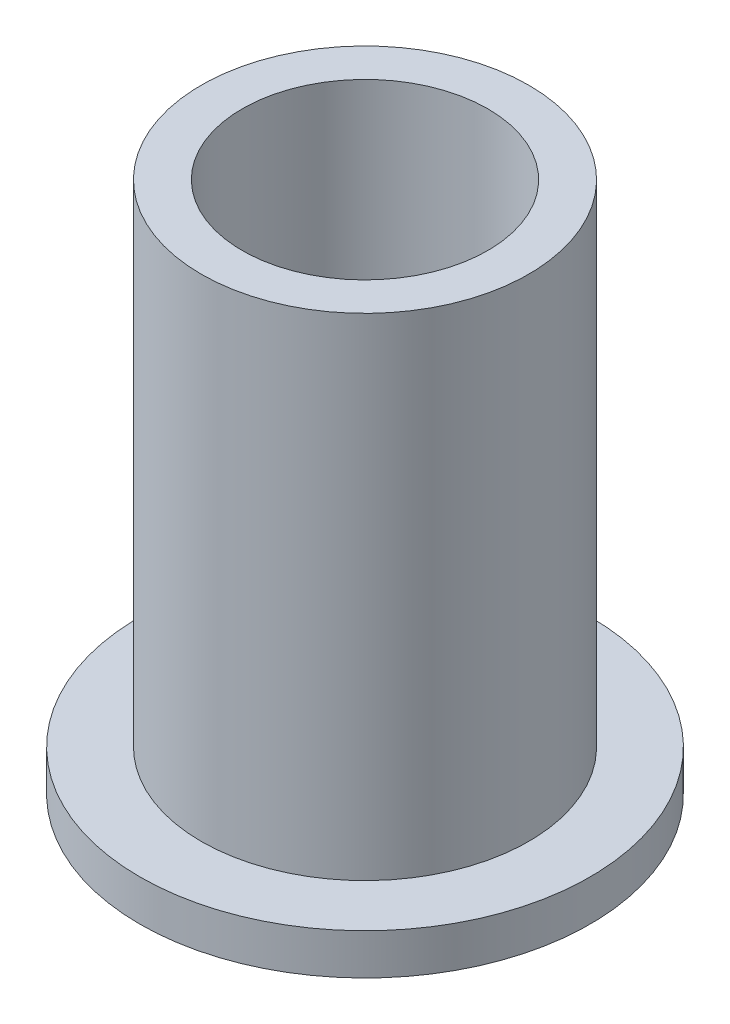
ISO-10303-21;
HEADER;
FILE_DESCRIPTION(('STEP AP214'),'2;1');
FILE_NAME('part.step','',(''),(''),'','','');
FILE_SCHEMA(('AUTOMOTIVE_DESIGN { 1 0 10303 214 1 1 1 1 }'));
ENDSEC;
DATA;
#1=APPLICATION_CONTEXT('core data for automotive mechanical design processes');
#2=APPLICATION_PROTOCOL_DEFINITION('international standard','automotive_design',2000,#1);
#3=PRODUCT_CONTEXT('',#1,'mechanical');
#4=PRODUCT('Part','Part','',(#3));
#5=PRODUCT_RELATED_PRODUCT_CATEGORY('part','',(#4));
#6=PRODUCT_DEFINITION_FORMATION('','',#4);
#7=PRODUCT_DEFINITION_CONTEXT('part definition',#1,'design');
#8=PRODUCT_DEFINITION('design','',#6,#7);
#9=PRODUCT_DEFINITION_SHAPE('','',#8);
#10=(LENGTH_UNIT() NAMED_UNIT(*) SI_UNIT(.MILLI.,.METRE.));
#11=(NAMED_UNIT(*) PLANE_ANGLE_UNIT() SI_UNIT($,.RADIAN.));
#12=(NAMED_UNIT(*) SI_UNIT($,.STERADIAN.) SOLID_ANGLE_UNIT());
#13=UNCERTAINTY_MEASURE_WITH_UNIT(LENGTH_MEASURE(1.E-05),#10,'distance_accuracy_value','');
#14=(GEOMETRIC_REPRESENTATION_CONTEXT(3) GLOBAL_UNCERTAINTY_ASSIGNED_CONTEXT((#13)) GLOBAL_UNIT_ASSIGNED_CONTEXT((#10,
#11,#12)) REPRESENTATION_CONTEXT('',''));
#15=CARTESIAN_POINT('',(0.,0.,0.));
#16=DIRECTION('',(0.,0.,1.));
#17=DIRECTION('',(1.,0.,0.));
#18=AXIS2_PLACEMENT_3D('',#15,#16,#17);
#19=CARTESIAN_POINT('',(8.73125,0.,0.));
#20=DIRECTION('',(0.,-1.,0.));
#21=DIRECTION('',(0.,0.,-1.));
#22=AXIS2_PLACEMENT_3D('',#19,#20,#21);
#23=PLANE('',#22);
#24=CARTESIAN_POINT('',(0.,0.,0.));
#25=DIRECTION('',(0.,-1.,0.));
#26=DIRECTION('',(0.,0.,-1.));
#27=AXIS2_PLACEMENT_3D('',#24,#25,#26);
#28=CIRCLE('',#27,8.73125);
#29=CARTESIAN_POINT('',(0.,0.,-8.73125));
#30=VERTEX_POINT('',#29);
#31=EDGE_CURVE('E52',#30,#30,#28,.T.);
#32=ORIENTED_EDGE('',*,*,#31,.T.);
#33=EDGE_LOOP('',(#32));
#34=FACE_BOUND('',#33,.T.);
#35=CARTESIAN_POINT('',(0.,0.,0.));
#36=DIRECTION('',(0.,-1.,0.));
#37=DIRECTION('',(0.,0.,-1.));
#38=AXIS2_PLACEMENT_3D('',#35,#36,#37);
#39=CIRCLE('',#38,4.7625);
#40=CARTESIAN_POINT('',(0.,0.,-4.7625));
#41=VERTEX_POINT('',#40);
#42=EDGE_CURVE('E10',#41,#41,#39,.T.);
#43=ORIENTED_EDGE('',*,*,#42,.F.);
#44=EDGE_LOOP('',(#43));
#45=FACE_BOUND('',#44,.T.);
#46=ADVANCED_FACE('F30',(#34,#45),#23,.T.);
#47=CARTESIAN_POINT('',(0.,0.,0.));
#48=DIRECTION('',(0.,-1.,0.));
#49=DIRECTION('',(0.,0.,-1.));
#50=AXIS2_PLACEMENT_3D('',#47,#48,#49);
#51=CYLINDRICAL_SURFACE('',#50,4.7625);
#52=ORIENTED_EDGE('',*,*,#42,.T.);
#53=EDGE_LOOP('',(#52));
#54=FACE_BOUND('',#53,.T.);
#55=CARTESIAN_POINT('',(0.,20.6375,0.));
#56=DIRECTION('',(0.,-1.,0.));
#57=DIRECTION('',(0.,0.,-1.));
#58=AXIS2_PLACEMENT_3D('',#55,#56,#57);
#59=CIRCLE('',#58,4.7625);
#60=CARTESIAN_POINT('',(0.,20.6375,-4.7625));
#61=VERTEX_POINT('',#60);
#62=EDGE_CURVE('E36',#61,#61,#59,.T.);
#63=ORIENTED_EDGE('',*,*,#62,.F.);
#64=EDGE_LOOP('',(#63));
#65=FACE_BOUND('',#64,.T.);
#66=ADVANCED_FACE('F70',(#54,#65),#51,.F.);
#67=CARTESIAN_POINT('',(4.7625,20.6375,0.));
#68=DIRECTION('',(0.,1.,0.));
#69=DIRECTION('',(0.,0.,1.));
#70=AXIS2_PLACEMENT_3D('',#67,#68,#69);
#71=PLANE('',#70);
#72=ORIENTED_EDGE('',*,*,#62,.T.);
#73=EDGE_LOOP('',(#72));
#74=FACE_BOUND('',#73,.T.);
#75=CARTESIAN_POINT('',(0.,20.6375,0.));
#76=DIRECTION('',(0.,-1.,0.));
#77=DIRECTION('',(0.,0.,-1.));
#78=AXIS2_PLACEMENT_3D('',#75,#76,#77);
#79=CIRCLE('',#78,6.35);
#80=CARTESIAN_POINT('',(0.,20.6375,-6.35));
#81=VERTEX_POINT('',#80);
#82=EDGE_CURVE('E40',#81,#81,#79,.T.);
#83=ORIENTED_EDGE('',*,*,#82,.F.);
#84=EDGE_LOOP('',(#83));
#85=FACE_BOUND('',#84,.T.);
#86=ADVANCED_FACE('F74',(#74,#85),#71,.T.);
#87=CARTESIAN_POINT('',(0.,0.,0.));
#88=DIRECTION('',(0.,-1.,0.));
#89=DIRECTION('',(0.,0.,-1.));
#90=AXIS2_PLACEMENT_3D('',#87,#88,#89);
#91=CYLINDRICAL_SURFACE('',#90,6.35);
#92=ORIENTED_EDGE('',*,*,#82,.T.);
#93=EDGE_LOOP('',(#92));
#94=FACE_BOUND('',#93,.T.);
#95=CARTESIAN_POINT('',(0.,1.5875,0.));
#96=DIRECTION('',(0.,-1.,0.));
#97=DIRECTION('',(0.,0.,-1.));
#98=AXIS2_PLACEMENT_3D('',#95,#96,#97);
#99=CIRCLE('',#98,6.35000000000001);
#100=CARTESIAN_POINT('',(0.,1.5875,-6.35000000000001));
#101=VERTEX_POINT('',#100);
#102=EDGE_CURVE('E44',#101,#101,#99,.T.);
#103=ORIENTED_EDGE('',*,*,#102,.F.);
#104=EDGE_LOOP('',(#103));
#105=FACE_BOUND('',#104,.T.);
#106=ADVANCED_FACE('F66',(#94,#105),#91,.T.);
#107=CARTESIAN_POINT('',(6.35000000000001,1.5875,0.));
#108=DIRECTION('',(0.,1.,0.));
#109=DIRECTION('',(0.,0.,1.));
#110=AXIS2_PLACEMENT_3D('',#107,#108,#109);
#111=PLANE('',#110);
#112=ORIENTED_EDGE('',*,*,#102,.T.);
#113=EDGE_LOOP('',(#112));
#114=FACE_BOUND('',#113,.T.);
#115=CARTESIAN_POINT('',(0.,1.5875,0.));
#116=DIRECTION('',(0.,-1.,0.));
#117=DIRECTION('',(0.,0.,-1.));
#118=AXIS2_PLACEMENT_3D('',#115,#116,#117);
#119=CIRCLE('',#118,8.73125);
#120=CARTESIAN_POINT('',(0.,1.5875,-8.73125));
#121=VERTEX_POINT('',#120);
#122=EDGE_CURVE('E49',#121,#121,#119,.T.);
#123=ORIENTED_EDGE('',*,*,#122,.F.);
#124=EDGE_LOOP('',(#123));
#125=FACE_BOUND('',#124,.T.);
#126=ADVANCED_FACE('F60',(#114,#125),#111,.T.);
#127=CARTESIAN_POINT('',(0.,0.,0.));
#128=DIRECTION('',(0.,-1.,0.));
#129=DIRECTION('',(0.,0.,-1.));
#130=AXIS2_PLACEMENT_3D('',#127,#128,#129);
#131=CYLINDRICAL_SURFACE('',#130,8.73125);
#132=ORIENTED_EDGE('',*,*,#122,.T.);
#133=EDGE_LOOP('',(#132));
#134=FACE_BOUND('',#133,.T.);
#135=ORIENTED_EDGE('',*,*,#31,.F.);
#136=EDGE_LOOP('',(#135));
#137=FACE_BOUND('',#136,.T.);
#138=ADVANCED_FACE('F58',(#134,#137),#131,.T.);
#139=CLOSED_SHELL('',(#46,#66,#86,#106,#126,#138));
#140=MANIFOLD_SOLID_BREP('B2',#139);
#141=ADVANCED_BREP_SHAPE_REPRESENTATION('',(#18,#140),#14);
#142=SHAPE_DEFINITION_REPRESENTATION(#9,#141);
ENDSEC;
END-ISO-10303-21;
